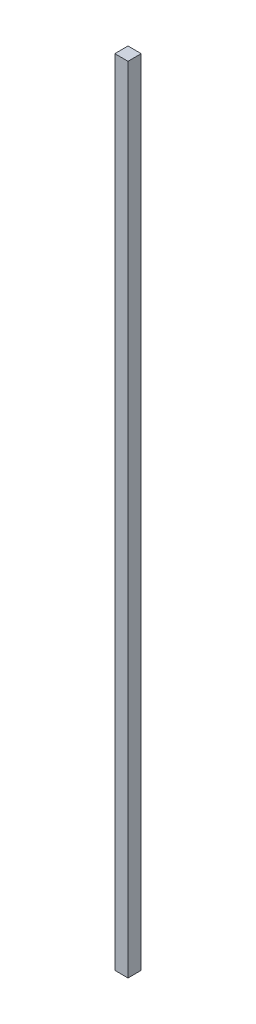
ISO-10303-21;
HEADER;
FILE_DESCRIPTION(('STEP AP214'),'2;1');
FILE_NAME('part.step','',(''),(''),'','','');
FILE_SCHEMA(('AUTOMOTIVE_DESIGN { 1 0 10303 214 1 1 1 1 }'));
ENDSEC;
DATA;
#1=APPLICATION_CONTEXT('core data for automotive mechanical design processes');
#2=APPLICATION_PROTOCOL_DEFINITION('international standard','automotive_design',2000,#1);
#3=PRODUCT_CONTEXT('',#1,'mechanical');
#4=PRODUCT('Part','Part','',(#3));
#5=PRODUCT_RELATED_PRODUCT_CATEGORY('part','',(#4));
#6=PRODUCT_DEFINITION_FORMATION('','',#4);
#7=PRODUCT_DEFINITION_CONTEXT('part definition',#1,'design');
#8=PRODUCT_DEFINITION('design','',#6,#7);
#9=PRODUCT_DEFINITION_SHAPE('','',#8);
#10=(LENGTH_UNIT() NAMED_UNIT(*) SI_UNIT(.MILLI.,.METRE.));
#11=(NAMED_UNIT(*) PLANE_ANGLE_UNIT() SI_UNIT($,.RADIAN.));
#12=(NAMED_UNIT(*) SI_UNIT($,.STERADIAN.) SOLID_ANGLE_UNIT());
#13=UNCERTAINTY_MEASURE_WITH_UNIT(LENGTH_MEASURE(1.E-05),#10,'distance_accuracy_value','');
#14=(GEOMETRIC_REPRESENTATION_CONTEXT(3) GLOBAL_UNCERTAINTY_ASSIGNED_CONTEXT((#13)) GLOBAL_UNIT_ASSIGNED_CONTEXT((#10,
#11,#12)) REPRESENTATION_CONTEXT('',''));
#15=CARTESIAN_POINT('',(0.,0.,0.));
#16=DIRECTION('',(0.,0.,1.));
#17=DIRECTION('',(1.,0.,0.));
#18=AXIS2_PLACEMENT_3D('',#15,#16,#17);
#19=CARTESIAN_POINT('',(-25.,3000.,-25.));
#20=DIRECTION('',(1.,0.,0.));
#21=DIRECTION('',(0.,0.,-1.));
#22=AXIS2_PLACEMENT_3D('',#19,#20,#21);
#23=PLANE('',#22);
#24=DIRECTION('',(0.,0.,1.));
#25=VECTOR('',#24,1.);
#26=CARTESIAN_POINT('',(-25.,0.,-25.));
#27=LINE('',#26,#25);
#28=CARTESIAN_POINT('',(-25.,0.,-25.));
#29=VERTEX_POINT('',#28);
#30=CARTESIAN_POINT('',(-25.,0.,25.));
#31=VERTEX_POINT('',#30);
#32=EDGE_CURVE('E111',#29,#31,#27,.T.);
#33=ORIENTED_EDGE('',*,*,#32,.T.);
#34=DIRECTION('',(0.,-1.,0.));
#35=VECTOR('',#34,1.);
#36=CARTESIAN_POINT('',(-25.,3000.,25.));
#37=LINE('',#36,#35);
#38=CARTESIAN_POINT('',(-25.,3000.,25.));
#39=VERTEX_POINT('',#38);
#40=EDGE_CURVE('E11',#39,#31,#37,.T.);
#41=ORIENTED_EDGE('',*,*,#40,.F.);
#42=DIRECTION('',(0.,0.,1.));
#43=VECTOR('',#42,1.);
#44=CARTESIAN_POINT('',(-25.,3000.,-25.));
#45=LINE('',#44,#43);
#46=CARTESIAN_POINT('',(-25.,3000.,-25.));
#47=VERTEX_POINT('',#46);
#48=EDGE_CURVE('E95',#47,#39,#45,.T.);
#49=ORIENTED_EDGE('',*,*,#48,.F.);
#50=DIRECTION('',(0.,-1.,0.));
#51=VECTOR('',#50,1.);
#52=CARTESIAN_POINT('',(-25.,3000.,-25.));
#53=LINE('',#52,#51);
#54=EDGE_CURVE('E107',#47,#29,#53,.T.);
#55=ORIENTED_EDGE('',*,*,#54,.T.);
#56=EDGE_LOOP('',(#33,#41,#49,#55));
#57=FACE_BOUND('',#56,.T.);
#58=ADVANCED_FACE('F43',(#57),#23,.F.);
#59=CARTESIAN_POINT('',(25.,3000.,25.));
#60=DIRECTION('',(0.,0.,-1.));
#61=DIRECTION('',(-1.,0.,0.));
#62=AXIS2_PLACEMENT_3D('',#59,#60,#61);
#63=PLANE('',#62);
#64=DIRECTION('',(1.,0.,0.));
#65=VECTOR('',#64,1.);
#66=CARTESIAN_POINT('',(25.,0.,25.));
#67=LINE('',#66,#65);
#68=CARTESIAN_POINT('',(25.,0.,25.));
#69=VERTEX_POINT('',#68);
#70=EDGE_CURVE('E100',#31,#69,#67,.T.);
#71=ORIENTED_EDGE('',*,*,#70,.T.);
#72=DIRECTION('',(0.,-1.,0.));
#73=VECTOR('',#72,1.);
#74=CARTESIAN_POINT('',(25.,3000.,25.));
#75=LINE('',#74,#73);
#76=CARTESIAN_POINT('',(25.,3000.,25.));
#77=VERTEX_POINT('',#76);
#78=EDGE_CURVE('E52',#77,#69,#75,.T.);
#79=ORIENTED_EDGE('',*,*,#78,.F.);
#80=DIRECTION('',(1.,0.,0.));
#81=VECTOR('',#80,1.);
#82=CARTESIAN_POINT('',(25.,3000.,25.));
#83=LINE('',#82,#81);
#84=EDGE_CURVE('E90',#39,#77,#83,.T.);
#85=ORIENTED_EDGE('',*,*,#84,.F.);
#86=ORIENTED_EDGE('',*,*,#40,.T.);
#87=EDGE_LOOP('',(#71,#79,#85,#86));
#88=FACE_BOUND('',#87,.T.);
#89=ADVANCED_FACE('F99',(#88),#63,.F.);
#90=CARTESIAN_POINT('',(25.,3000.,-25.));
#91=DIRECTION('',(-1.,0.,0.));
#92=DIRECTION('',(0.,0.,1.));
#93=AXIS2_PLACEMENT_3D('',#90,#91,#92);
#94=PLANE('',#93);
#95=DIRECTION('',(0.,0.,-1.));
#96=VECTOR('',#95,1.);
#97=CARTESIAN_POINT('',(25.,0.,-25.));
#98=LINE('',#97,#96);
#99=CARTESIAN_POINT('',(25.,0.,-25.));
#100=VERTEX_POINT('',#99);
#101=EDGE_CURVE('E77',#69,#100,#98,.T.);
#102=ORIENTED_EDGE('',*,*,#101,.T.);
#103=DIRECTION('',(0.,-1.,0.));
#104=VECTOR('',#103,1.);
#105=CARTESIAN_POINT('',(25.,3000.,-25.));
#106=LINE('',#105,#104);
#107=CARTESIAN_POINT('',(25.,3000.,-25.));
#108=VERTEX_POINT('',#107);
#109=EDGE_CURVE('E102',#108,#100,#106,.T.);
#110=ORIENTED_EDGE('',*,*,#109,.F.);
#111=DIRECTION('',(0.,0.,-1.));
#112=VECTOR('',#111,1.);
#113=CARTESIAN_POINT('',(25.,3000.,-25.));
#114=LINE('',#113,#112);
#115=EDGE_CURVE('E93',#77,#108,#114,.T.);
#116=ORIENTED_EDGE('',*,*,#115,.F.);
#117=ORIENTED_EDGE('',*,*,#78,.T.);
#118=EDGE_LOOP('',(#102,#110,#116,#117));
#119=FACE_BOUND('',#118,.T.);
#120=ADVANCED_FACE('F103',(#119),#94,.F.);
#121=CARTESIAN_POINT('',(25.,3000.,-25.));
#122=DIRECTION('',(0.,0.,1.));
#123=DIRECTION('',(1.,0.,0.));
#124=AXIS2_PLACEMENT_3D('',#121,#122,#123);
#125=PLANE('',#124);
#126=DIRECTION('',(-1.,0.,0.));
#127=VECTOR('',#126,1.);
#128=CARTESIAN_POINT('',(25.,0.,-25.));
#129=LINE('',#128,#127);
#130=EDGE_CURVE('E83',#100,#29,#129,.T.);
#131=ORIENTED_EDGE('',*,*,#130,.T.);
#132=ORIENTED_EDGE('',*,*,#54,.F.);
#133=DIRECTION('',(-1.,0.,0.));
#134=VECTOR('',#133,1.);
#135=CARTESIAN_POINT('',(25.,3000.,-25.));
#136=LINE('',#135,#134);
#137=EDGE_CURVE('E60',#108,#47,#136,.T.);
#138=ORIENTED_EDGE('',*,*,#137,.F.);
#139=ORIENTED_EDGE('',*,*,#109,.T.);
#140=EDGE_LOOP('',(#131,#132,#138,#139));
#141=FACE_BOUND('',#140,.T.);
#142=ADVANCED_FACE('F124',(#141),#125,.F.);
#143=CARTESIAN_POINT('',(0.,3000.,0.));
#144=DIRECTION('',(0.,-1.,0.));
#145=DIRECTION('',(0.,0.,-1.));
#146=AXIS2_PLACEMENT_3D('',#143,#144,#145);
#147=PLANE('',#146);
#148=ORIENTED_EDGE('',*,*,#48,.T.);
#149=ORIENTED_EDGE('',*,*,#84,.T.);
#150=ORIENTED_EDGE('',*,*,#115,.T.);
#151=ORIENTED_EDGE('',*,*,#137,.T.);
#152=EDGE_LOOP('',(#148,#149,#150,#151));
#153=FACE_BOUND('',#152,.T.);
#154=ADVANCED_FACE('F91',(#153),#147,.F.);
#155=CARTESIAN_POINT('',(0.,0.,0.));
#156=DIRECTION('',(0.,-1.,0.));
#157=DIRECTION('',(0.,0.,-1.));
#158=AXIS2_PLACEMENT_3D('',#155,#156,#157);
#159=PLANE('',#158);
#160=ORIENTED_EDGE('',*,*,#32,.F.);
#161=ORIENTED_EDGE('',*,*,#130,.F.);
#162=ORIENTED_EDGE('',*,*,#101,.F.);
#163=ORIENTED_EDGE('',*,*,#70,.F.);
#164=EDGE_LOOP('',(#160,#161,#162,#163));
#165=FACE_BOUND('',#164,.T.);
#166=ADVANCED_FACE('F127',(#165),#159,.T.);
#167=CLOSED_SHELL('',(#58,#89,#120,#142,#154,#166));
#168=MANIFOLD_SOLID_BREP('B2',#167);
#169=ADVANCED_BREP_SHAPE_REPRESENTATION('',(#18,#168),#14);
#170=SHAPE_DEFINITION_REPRESENTATION(#9,#169);
ENDSEC;
END-ISO-10303-21;
